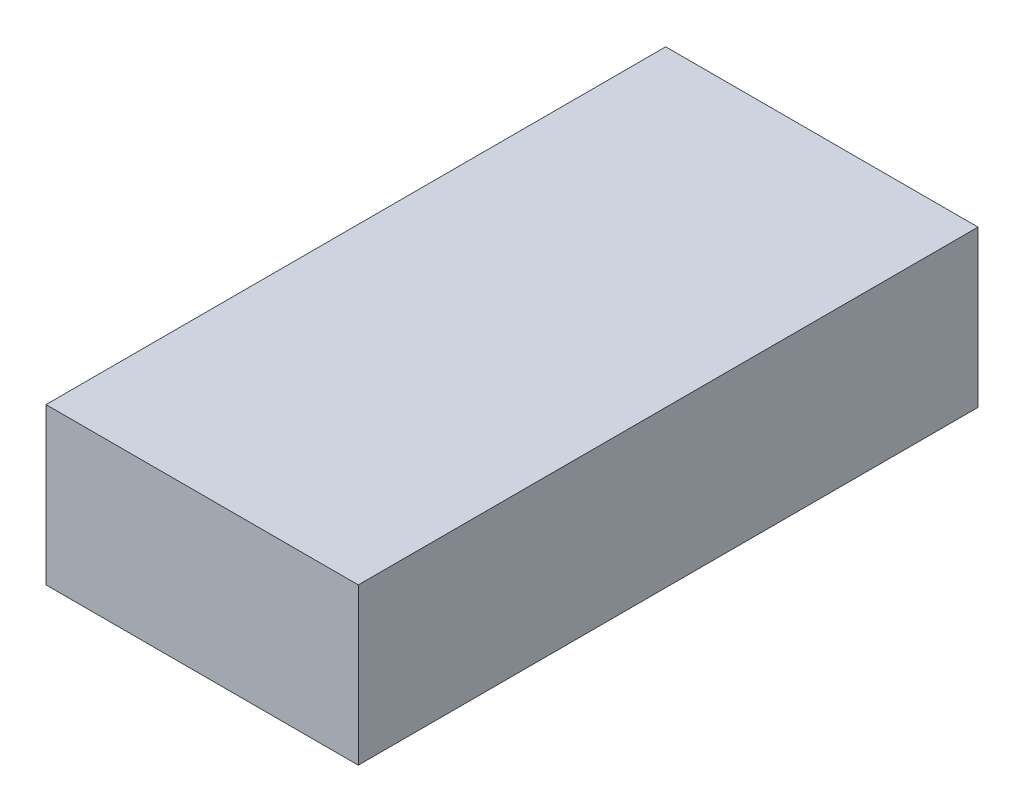
ISO-10303-21;
HEADER;
FILE_DESCRIPTION(('STEP AP214'),'2;1');
FILE_NAME('part.step','',(''),(''),'','','');
FILE_SCHEMA(('AUTOMOTIVE_DESIGN { 1 0 10303 214 1 1 1 1 }'));
ENDSEC;
DATA;
#1=APPLICATION_CONTEXT('core data for automotive mechanical design processes');
#2=APPLICATION_PROTOCOL_DEFINITION('international standard','automotive_design',2000,#1);
#3=PRODUCT_CONTEXT('',#1,'mechanical');
#4=PRODUCT('Part','Part','',(#3));
#5=PRODUCT_RELATED_PRODUCT_CATEGORY('part','',(#4));
#6=PRODUCT_DEFINITION_FORMATION('','',#4);
#7=PRODUCT_DEFINITION_CONTEXT('part definition',#1,'design');
#8=PRODUCT_DEFINITION('design','',#6,#7);
#9=PRODUCT_DEFINITION_SHAPE('','',#8);
#10=(LENGTH_UNIT() NAMED_UNIT(*) SI_UNIT(.MILLI.,.METRE.));
#11=(NAMED_UNIT(*) PLANE_ANGLE_UNIT() SI_UNIT($,.RADIAN.));
#12=(NAMED_UNIT(*) SI_UNIT($,.STERADIAN.) SOLID_ANGLE_UNIT());
#13=UNCERTAINTY_MEASURE_WITH_UNIT(LENGTH_MEASURE(1.E-05),#10,'distance_accuracy_value','');
#14=(GEOMETRIC_REPRESENTATION_CONTEXT(3) GLOBAL_UNCERTAINTY_ASSIGNED_CONTEXT((#13)) GLOBAL_UNIT_ASSIGNED_CONTEXT((#10,
#11,#12)) REPRESENTATION_CONTEXT('',''));
#15=CARTESIAN_POINT('',(0.,0.,0.));
#16=DIRECTION('',(0.,0.,1.));
#17=DIRECTION('',(1.,0.,0.));
#18=AXIS2_PLACEMENT_3D('',#15,#16,#17);
#19=CARTESIAN_POINT('',(20.,10.,-39.6875));
#20=DIRECTION('',(1.,0.,0.));
#21=DIRECTION('',(0.,0.,-1.));
#22=AXIS2_PLACEMENT_3D('',#19,#20,#21);
#23=PLANE('',#22);
#24=DIRECTION('',(0.,0.,1.));
#25=VECTOR('',#24,1.);
#26=CARTESIAN_POINT('',(20.,10.,-39.6875));
#27=LINE('',#26,#25);
#28=CARTESIAN_POINT('',(20.,10.,-39.6875));
#29=VERTEX_POINT('',#28);
#30=CARTESIAN_POINT('',(20.,10.,39.6875));
#31=VERTEX_POINT('',#30);
#32=EDGE_CURVE('E36',#29,#31,#27,.T.);
#33=ORIENTED_EDGE('',*,*,#32,.T.);
#34=DIRECTION('',(0.,1.,0.));
#35=VECTOR('',#34,1.);
#36=CARTESIAN_POINT('',(20.,10.,39.6875));
#37=LINE('',#36,#35);
#38=CARTESIAN_POINT('',(20.,-10.,39.6875));
#39=VERTEX_POINT('',#38);
#40=EDGE_CURVE('E73',#39,#31,#37,.T.);
#41=ORIENTED_EDGE('',*,*,#40,.F.);
#42=DIRECTION('',(0.,0.,1.));
#43=VECTOR('',#42,1.);
#44=CARTESIAN_POINT('',(20.,-10.,-39.6875));
#45=LINE('',#44,#43);
#46=CARTESIAN_POINT('',(20.,-10.,-39.6875));
#47=VERTEX_POINT('',#46);
#48=EDGE_CURVE('E11',#47,#39,#45,.T.);
#49=ORIENTED_EDGE('',*,*,#48,.F.);
#50=DIRECTION('',(0.,1.,0.));
#51=VECTOR('',#50,1.);
#52=CARTESIAN_POINT('',(20.,10.,-39.6875));
#53=LINE('',#52,#51);
#54=EDGE_CURVE('E74',#47,#29,#53,.T.);
#55=ORIENTED_EDGE('',*,*,#54,.T.);
#56=EDGE_LOOP('',(#33,#41,#49,#55));
#57=FACE_BOUND('',#56,.T.);
#58=ADVANCED_FACE('F33',(#57),#23,.T.);
#59=CARTESIAN_POINT('',(-20.,-10.,-39.6875));
#60=DIRECTION('',(0.,-1.,0.));
#61=DIRECTION('',(0.,0.,-1.));
#62=AXIS2_PLACEMENT_3D('',#59,#60,#61);
#63=PLANE('',#62);
#64=ORIENTED_EDGE('',*,*,#48,.T.);
#65=DIRECTION('',(1.,0.,0.));
#66=VECTOR('',#65,1.);
#67=CARTESIAN_POINT('',(-20.,-10.,39.6875));
#68=LINE('',#67,#66);
#69=CARTESIAN_POINT('',(-20.,-10.,39.6875));
#70=VERTEX_POINT('',#69);
#71=EDGE_CURVE('E90',#70,#39,#68,.T.);
#72=ORIENTED_EDGE('',*,*,#71,.F.);
#73=DIRECTION('',(0.,0.,1.));
#74=VECTOR('',#73,1.);
#75=CARTESIAN_POINT('',(-20.,-10.,-39.6875));
#76=LINE('',#75,#74);
#77=CARTESIAN_POINT('',(-20.,-10.,-39.6875));
#78=VERTEX_POINT('',#77);
#79=EDGE_CURVE('E41',#78,#70,#76,.T.);
#80=ORIENTED_EDGE('',*,*,#79,.F.);
#81=DIRECTION('',(1.,0.,0.));
#82=VECTOR('',#81,1.);
#83=CARTESIAN_POINT('',(-20.,-10.,-39.6875));
#84=LINE('',#83,#82);
#85=EDGE_CURVE('E79',#78,#47,#84,.T.);
#86=ORIENTED_EDGE('',*,*,#85,.T.);
#87=EDGE_LOOP('',(#64,#72,#80,#86));
#88=FACE_BOUND('',#87,.T.);
#89=ADVANCED_FACE('F105',(#88),#63,.T.);
#90=CARTESIAN_POINT('',(-20.,10.,-39.6875));
#91=DIRECTION('',(-1.,0.,0.));
#92=DIRECTION('',(0.,0.,1.));
#93=AXIS2_PLACEMENT_3D('',#90,#91,#92);
#94=PLANE('',#93);
#95=ORIENTED_EDGE('',*,*,#79,.T.);
#96=DIRECTION('',(0.,-1.,0.));
#97=VECTOR('',#96,1.);
#98=CARTESIAN_POINT('',(-20.,10.,39.6875));
#99=LINE('',#98,#97);
#100=CARTESIAN_POINT('',(-20.,10.,39.6875));
#101=VERTEX_POINT('',#100);
#102=EDGE_CURVE('E86',#101,#70,#99,.T.);
#103=ORIENTED_EDGE('',*,*,#102,.F.);
#104=DIRECTION('',(0.,0.,1.));
#105=VECTOR('',#104,1.);
#106=CARTESIAN_POINT('',(-20.,10.,-39.6875));
#107=LINE('',#106,#105);
#108=CARTESIAN_POINT('',(-20.,10.,-39.6875));
#109=VERTEX_POINT('',#108);
#110=EDGE_CURVE('E78',#109,#101,#107,.T.);
#111=ORIENTED_EDGE('',*,*,#110,.F.);
#112=DIRECTION('',(0.,-1.,0.));
#113=VECTOR('',#112,1.);
#114=CARTESIAN_POINT('',(-20.,10.,-39.6875));
#115=LINE('',#114,#113);
#116=EDGE_CURVE('E98',#109,#78,#115,.T.);
#117=ORIENTED_EDGE('',*,*,#116,.T.);
#118=EDGE_LOOP('',(#95,#103,#111,#117));
#119=FACE_BOUND('',#118,.T.);
#120=ADVANCED_FACE('F102',(#119),#94,.T.);
#121=CARTESIAN_POINT('',(-20.,10.,-39.6875));
#122=DIRECTION('',(0.,1.,0.));
#123=DIRECTION('',(0.,0.,1.));
#124=AXIS2_PLACEMENT_3D('',#121,#122,#123);
#125=PLANE('',#124);
#126=ORIENTED_EDGE('',*,*,#110,.T.);
#127=DIRECTION('',(-1.,0.,0.));
#128=VECTOR('',#127,1.);
#129=CARTESIAN_POINT('',(-20.,10.,39.6875));
#130=LINE('',#129,#128);
#131=EDGE_CURVE('E81',#31,#101,#130,.T.);
#132=ORIENTED_EDGE('',*,*,#131,.F.);
#133=ORIENTED_EDGE('',*,*,#32,.F.);
#134=DIRECTION('',(-1.,0.,0.));
#135=VECTOR('',#134,1.);
#136=CARTESIAN_POINT('',(-20.,10.,-39.6875));
#137=LINE('',#136,#135);
#138=EDGE_CURVE('E96',#29,#109,#137,.T.);
#139=ORIENTED_EDGE('',*,*,#138,.T.);
#140=EDGE_LOOP('',(#126,#132,#133,#139));
#141=FACE_BOUND('',#140,.T.);
#142=ADVANCED_FACE('F82',(#141),#125,.T.);
#143=CARTESIAN_POINT('',(0.,0.,-39.6875));
#144=DIRECTION('',(0.,0.,1.));
#145=DIRECTION('',(1.,0.,0.));
#146=AXIS2_PLACEMENT_3D('',#143,#144,#145);
#147=PLANE('',#146);
#148=ORIENTED_EDGE('',*,*,#54,.F.);
#149=ORIENTED_EDGE('',*,*,#85,.F.);
#150=ORIENTED_EDGE('',*,*,#116,.F.);
#151=ORIENTED_EDGE('',*,*,#138,.F.);
#152=EDGE_LOOP('',(#148,#149,#150,#151));
#153=FACE_BOUND('',#152,.T.);
#154=ADVANCED_FACE('F107',(#153),#147,.F.);
#155=CARTESIAN_POINT('',(0.,0.,39.6875));
#156=DIRECTION('',(0.,0.,1.));
#157=DIRECTION('',(1.,0.,0.));
#158=AXIS2_PLACEMENT_3D('',#155,#156,#157);
#159=PLANE('',#158);
#160=ORIENTED_EDGE('',*,*,#40,.T.);
#161=ORIENTED_EDGE('',*,*,#131,.T.);
#162=ORIENTED_EDGE('',*,*,#102,.T.);
#163=ORIENTED_EDGE('',*,*,#71,.T.);
#164=EDGE_LOOP('',(#160,#161,#162,#163));
#165=FACE_BOUND('',#164,.T.);
#166=ADVANCED_FACE('F89',(#165),#159,.T.);
#167=CLOSED_SHELL('',(#58,#89,#120,#142,#154,#166));
#168=MANIFOLD_SOLID_BREP('B2',#167);
#169=ADVANCED_BREP_SHAPE_REPRESENTATION('',(#18,#168),#14);
#170=SHAPE_DEFINITION_REPRESENTATION(#9,#169);
ENDSEC;
END-ISO-10303-21;
